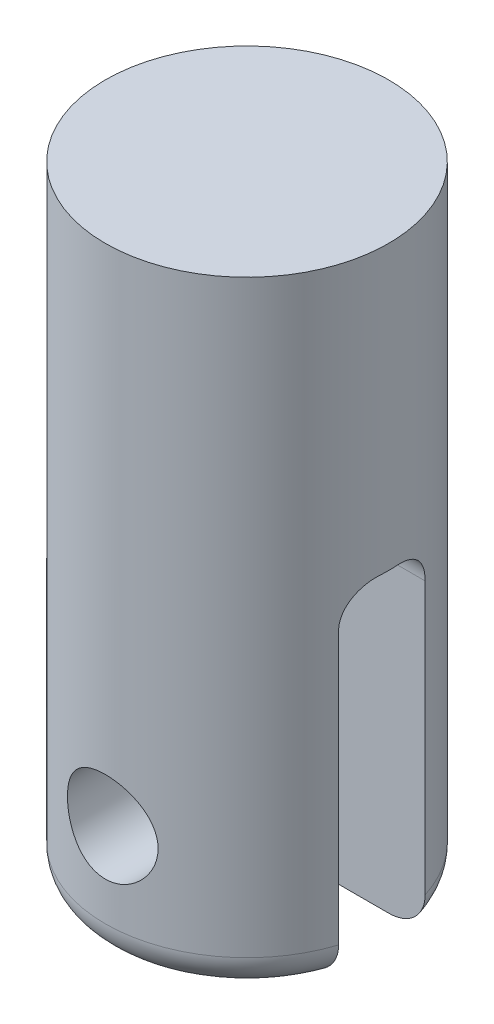
ISO-10303-21;
HEADER;
FILE_DESCRIPTION(('STEP AP214'),'2;1');
FILE_NAME('part.step','',(''),(''),'','','');
FILE_SCHEMA(('AUTOMOTIVE_DESIGN { 1 0 10303 214 1 1 1 1 }'));
ENDSEC;
DATA;
#1=APPLICATION_CONTEXT('core data for automotive mechanical design processes');
#2=APPLICATION_PROTOCOL_DEFINITION('international standard','automotive_design',2000,#1);
#3=PRODUCT_CONTEXT('',#1,'mechanical');
#4=PRODUCT('Part','Part','',(#3));
#5=PRODUCT_RELATED_PRODUCT_CATEGORY('part','',(#4));
#6=PRODUCT_DEFINITION_FORMATION('','',#4);
#7=PRODUCT_DEFINITION_CONTEXT('part definition',#1,'design');
#8=PRODUCT_DEFINITION('design','',#6,#7);
#9=PRODUCT_DEFINITION_SHAPE('','',#8);
#10=(LENGTH_UNIT() NAMED_UNIT(*) SI_UNIT(.MILLI.,.METRE.));
#11=(NAMED_UNIT(*) PLANE_ANGLE_UNIT() SI_UNIT($,.RADIAN.));
#12=(NAMED_UNIT(*) SI_UNIT($,.STERADIAN.) SOLID_ANGLE_UNIT());
#13=UNCERTAINTY_MEASURE_WITH_UNIT(LENGTH_MEASURE(1.E-05),#10,'distance_accuracy_value','');
#14=(GEOMETRIC_REPRESENTATION_CONTEXT(3) GLOBAL_UNCERTAINTY_ASSIGNED_CONTEXT((#13)) GLOBAL_UNIT_ASSIGNED_CONTEXT((#10,
#11,#12)) REPRESENTATION_CONTEXT('',''));
#15=CARTESIAN_POINT('',(0.,0.,0.));
#16=DIRECTION('',(0.,0.,1.));
#17=DIRECTION('',(1.,0.,0.));
#18=AXIS2_PLACEMENT_3D('',#15,#16,#17);
#19=CARTESIAN_POINT('',(0.,-15.,0.));
#20=DIRECTION('',(0.,1.,0.));
#21=DIRECTION('',(0.,0.,1.));
#22=AXIS2_PLACEMENT_3D('',#19,#20,#21);
#23=PLANE('',#22);
#24=DIRECTION('',(-1.,0.,0.));
#25=VECTOR('',#24,1.);
#26=CARTESIAN_POINT('',(0.,-15.,-3.81769416483632));
#27=LINE('',#26,#25);
#28=CARTESIAN_POINT('',(8.69915003111078,-15.,-3.81769416483632));
#29=VERTEX_POINT('',#28);
#30=CARTESIAN_POINT('',(-8.69915003111078,-15.,-3.81769416483632));
#31=VERTEX_POINT('',#30);
#32=EDGE_CURVE('E112',#29,#31,#27,.T.);
#33=ORIENTED_EDGE('',*,*,#32,.T.);
#34=CARTESIAN_POINT('',(0.,-15.,0.));
#35=DIRECTION('',(0.,1.,0.));
#36=DIRECTION('',(0.,0.,1.));
#37=AXIS2_PLACEMENT_3D('',#34,#35,#36);
#38=CIRCLE('',#37,9.5);
#39=EDGE_CURVE('E239',#31,#29,#38,.F.);
#40=ORIENTED_EDGE('',*,*,#39,.T.);
#41=EDGE_LOOP('',(#33,#40));
#42=FACE_BOUND('',#41,.T.);
#43=ADVANCED_FACE('F31',(#42),#23,.F.);
#44=CARTESIAN_POINT('',(0.,40.,0.));
#45=DIRECTION('',(0.,-1.,0.));
#46=DIRECTION('',(0.,0.,-1.));
#47=AXIS2_PLACEMENT_3D('',#44,#45,#46);
#48=CYLINDRICAL_SURFACE('',#47,12.5);
#49=CARTESIAN_POINT('',(0.,-0.58171759885595,-12.5));
#50=CARTESIAN_POINT('',(-0.218739515789949,-0.58171820798241,-12.4999994635907));
#51=CARTESIAN_POINT('',(-0.437486592647652,-0.59971908705409,-12.4942046039089));
#52=CARTESIAN_POINT('',(-0.868567253093707,-0.671047147679103,-12.4716565543057));
#53=CARTESIAN_POINT('',(-1.08089965843427,-0.724380778400727,-12.454901363839));
#54=CARTESIAN_POINT('',(-1.49287306447891,-0.864379901885378,-12.4122595908852));
#55=CARTESIAN_POINT('',(-1.69253368346149,-0.950992329782463,-12.3863875511298));
#56=CARTESIAN_POINT('',(-2.07449690712789,-1.1548596740741,-12.3281725410718));
#57=CARTESIAN_POINT('',(-2.25679651756237,-1.27211986326997,-12.2958284575098));
#58=CARTESIAN_POINT('',(-2.60473689448745,-1.53792788261603,-12.2269266983455));
#59=CARTESIAN_POINT('',(-2.76974023061599,-1.68728534623953,-12.1902739433225));
#60=CARTESIAN_POINT('',(-3.07283559233071,-2.01132526522444,-12.1174266425772));
#61=CARTESIAN_POINT('',(-3.21092229484498,-2.18601271799302,-12.0812321888099));
#62=CARTESIAN_POINT('',(-3.45978487684573,-2.56134973513202,-12.012370269974));
#63=CARTESIAN_POINT('',(-3.56975307774839,-2.76255830203272,-11.9798196408788));
#64=CARTESIAN_POINT('',(-3.75402292836496,-3.18182345828081,-11.9233664449728));
#65=CARTESIAN_POINT('',(-3.82833449433394,-3.39987534382518,-11.8994614742253));
#66=CARTESIAN_POINT('',(-3.93682835778228,-3.83942411703963,-11.8640030689908));
#67=CARTESIAN_POINT('',(-3.97219742115686,-4.0605978532415,-11.8520853732299));
#68=CARTESIAN_POINT('',(-4.00551082647404,-4.50603659681162,-11.8408707762137));
#69=CARTESIAN_POINT('',(-4.00346567735333,-4.7303007184655,-11.8415703310132));
#70=CARTESIAN_POINT('',(-3.96293451839878,-5.16563156110501,-11.8551904771854));
#71=CARTESIAN_POINT('',(-3.92597105327877,-5.37685873255691,-11.8676004346024));
#72=CARTESIAN_POINT('',(-3.81912647431514,-5.78993970999589,-11.9024114349979));
#73=CARTESIAN_POINT('',(-3.74924170672462,-5.99179247283861,-11.9248135869381));
#74=CARTESIAN_POINT('',(-3.57749112898224,-6.38396224589293,-11.9774663544073));
#75=CARTESIAN_POINT('',(-3.47515682759627,-6.57405814872729,-12.0078307368189));
#76=CARTESIAN_POINT('',(-3.24173735834848,-6.93487270643022,-12.0729361214443));
#77=CARTESIAN_POINT('',(-3.11064442067799,-7.1055861057168,-12.1076783053403));
#78=CARTESIAN_POINT('',(-2.81601378851059,-7.43137928101955,-12.1796593035711));
#79=CARTESIAN_POINT('',(-2.6512234062353,-7.58531954120242,-12.216938020211));
#80=CARTESIAN_POINT('',(-2.29770358054263,-7.86366429444063,-12.2883292028654));
#81=CARTESIAN_POINT('',(-2.10897218913167,-7.98806638171334,-12.3224414108409));
#82=CARTESIAN_POINT('',(-1.710653951781,-8.20462620705636,-12.3840447436164));
#83=CARTESIAN_POINT('',(-1.50090319860161,-8.29650035094699,-12.411477013699));
#84=CARTESIAN_POINT('',(-1.06783962590281,-8.44331659051276,-12.4562040275044));
#85=CARTESIAN_POINT('',(-0.844531157828865,-8.49827046839775,-12.4735020051158));
#86=CARTESIAN_POINT('',(-0.4003544739733,-8.56771776551898,-12.4954856059785));
#87=CARTESIAN_POINT('',(-0.179750715042685,-8.5837527828837,-12.5006515044539));
#88=CARTESIAN_POINT('',(0.261025673970266,-8.57926955330269,-12.4992163829611));
#89=CARTESIAN_POINT('',(0.4811983652186,-8.55875693558125,-12.4926171751051));
#90=CARTESIAN_POINT('',(0.908837545509531,-8.48299231615304,-12.4687095079374));
#91=CARTESIAN_POINT('',(1.11648590619506,-8.42866782364119,-12.4516871662316));
#92=CARTESIAN_POINT('',(1.51965413650146,-8.28796310036532,-12.4089396498837));
#93=CARTESIAN_POINT('',(1.71517248448531,-8.20157885735051,-12.3832133859887));
#94=CARTESIAN_POINT('',(2.09399230967611,-7.99679005591057,-12.3248882754976));
#95=CARTESIAN_POINT('',(2.27686405125242,-7.87763631900019,-12.2921331567523));
#96=CARTESIAN_POINT('',(2.62052875751655,-7.61158291639186,-12.223485206012));
#97=CARTESIAN_POINT('',(2.78131543888496,-7.46467538271019,-12.187591485802));
#98=CARTESIAN_POINT('',(3.08320803721588,-7.14003219982855,-12.1148241820809));
#99=CARTESIAN_POINT('',(3.22321448689051,-6.96126692963475,-12.0779721041684));
#100=CARTESIAN_POINT('',(3.47135354981423,-6.58198091271042,-12.0090110777536));
#101=CARTESIAN_POINT('',(3.57948642564104,-6.38146034522083,-11.9769020901785));
#102=CARTESIAN_POINT('',(3.76018950753079,-5.96460865221574,-11.9214065721644));
#103=CARTESIAN_POINT('',(3.83287665768614,-5.74833226138172,-11.8979914205013));
#104=CARTESIAN_POINT('',(3.94051670615503,-5.30569957433014,-11.8627820424832));
#105=CARTESIAN_POINT('',(3.97548487516417,-5.07934739601599,-11.8509831134183));
#106=CARTESIAN_POINT('',(4.00556338278915,-4.63452767594597,-11.8408481974692));
#107=CARTESIAN_POINT('',(4.00248471115015,-4.41619507053347,-11.8419004772846));
#108=CARTESIAN_POINT('',(3.96095887873426,-3.9833250852692,-11.8558539773436));
#109=CARTESIAN_POINT('',(3.92251352152803,-3.76878751245337,-11.8687545933658));
#110=CARTESIAN_POINT('',(3.81258331041153,-3.35300903541374,-11.9045135786104));
#111=CARTESIAN_POINT('',(3.74164069856766,-3.15160960162377,-11.9272081809191));
#112=CARTESIAN_POINT('',(3.56916068710955,-2.76341319785392,-11.979949389859));
#113=CARTESIAN_POINT('',(3.46761685286564,-2.5766193094492,-12.009997542498));
#114=CARTESIAN_POINT('',(3.2319816676858,-2.21469352431993,-12.0755873592094));
#115=CARTESIAN_POINT('',(3.09673271078946,-2.04034694202084,-12.111302976317));
#116=CARTESIAN_POINT('',(2.79953499482211,-1.71623823430354,-12.1834295211838));
#117=CARTESIAN_POINT('',(2.63757895417057,-1.56648283585933,-12.2198406361674));
#118=CARTESIAN_POINT('',(2.28478052574588,-1.29057188404637,-12.2907777050029));
#119=CARTESIAN_POINT('',(2.09312837940195,-1.16542021914519,-12.3251937970096));
#120=CARTESIAN_POINT('',(1.69040882481734,-0.949267128612882,-12.3868446924465));
#121=CARTESIAN_POINT('',(1.47934815802039,-0.858253900553964,-12.4140819767823));
#122=CARTESIAN_POINT('',(1.05915857911211,-0.71859814927985,-12.4567085266016));
#123=CARTESIAN_POINT('',(0.850941916218325,-0.667421472398177,-12.4727975325363));
#124=CARTESIAN_POINT('',(0.428485002690298,-0.59898474159592,-12.4944423385348));
#125=CARTESIAN_POINT('',(0.214246128153487,-0.581717002242278,-12.5000005253903));
#126=CARTESIAN_POINT('',(0.,-0.58171759885595,-12.5));
#127=B_SPLINE_CURVE_WITH_KNOTS('',3,(#49,#50,#51,#52,#53,#54,#55,#56,#57,#58,#59,#60,#61,#62,
#63,#64,#65,#66,#67,#68,#69,#70,#71,#72,#73,#74,#75,#76,#77,#78,#79,#80,#81,#82,#83,#84,#85,#86,
#87,#88,#89,#90,#91,#92,#93,#94,#95,#96,#97,#98,#99,#100,#101,#102,#103,#104,#105,#106,#107,
#108,#109,#110,#111,#112,#113,#114,#115,#116,#117,#118,#119,#120,#121,#122,#123,#124,#125,#126),
.UNSPECIFIED.,.T.,.F.,(4,2,2,2,2,2,2,2,2,2,2,2,2,2,2,2,2,2,2,2,2,2,2,2,2,2,2,2,2,2,2,2,2,2,2,2,
2,2,4),(0.,0.655430724666219,1.31098111587091,1.96549050527928,2.62011257411757,
3.29374295378917,3.96750641671065,4.65887072066567,5.35004264179887,6.01951224998766,
6.68879381985559,7.33017723381302,7.97163184802041,8.62280489842004,9.27415409537618,
9.95668212026653,10.6392657156648,11.3276617834058,12.0158380617097,12.6762752648346,
13.3366107533684,13.9795854097457,14.6226405610093,15.281833876428,15.9412143491714,
16.6280748263774,17.3149296449995,17.9995027669286,18.6837986322709,19.3356533743721,
19.9874748761256,20.6287955720838,21.2702512150686,21.937843916949,22.6056189371905,
23.2966571383324,23.9874562112942,24.6295685076846,25.2715352530413),.UNSPECIFIED.);
#128=CARTESIAN_POINT('',(0.,-0.58171759885595,-12.5));
#129=VERTEX_POINT('',#128);
#130=EDGE_CURVE('E166',#129,#129,#127,.T.);
#131=ORIENTED_EDGE('',*,*,#130,.T.);
#132=EDGE_LOOP('',(#131));
#133=FACE_BOUND('',#132,.T.);
#134=CARTESIAN_POINT('',(4.,-4.58171759885595,11.842719282327));
#135=CARTESIAN_POINT('',(3.99999935935302,-4.80013319382885,11.8427199699566));
#136=CARTESIAN_POINT('',(3.98204982916322,-5.01855635824237,11.8488277399487));
#137=CARTESIAN_POINT('',(3.91094422931103,-5.44896656790635,11.8724842974625));
#138=CARTESIAN_POINT('',(3.85777999166795,-5.6609521080295,11.8900357393061));
#139=CARTESIAN_POINT('',(3.71827554706383,-6.07218785295789,11.9343925365716));
#140=CARTESIAN_POINT('',(3.6319962541729,-6.2714606621111,11.9611808918508));
#141=CARTESIAN_POINT('',(3.42891586136008,-6.65276170141101,12.0209691387475));
#142=CARTESIAN_POINT('',(3.3121088807135,-6.83478659977764,12.0539702268166));
#143=CARTESIAN_POINT('',(3.04678104882872,-7.18298358668528,12.1237992191192));
#144=CARTESIAN_POINT('',(2.89734836823298,-7.34844301254282,12.1607169507637));
#145=CARTESIAN_POINT('',(2.57296030582542,-7.65243366351566,12.2334570053411));
#146=CARTESIAN_POINT('',(2.39800118371827,-7.79096093541142,12.269279166812));
#147=CARTESIAN_POINT('',(2.02237355615693,-8.04033106210593,12.3368238271391));
#148=CARTESIAN_POINT('',(1.82119171965248,-8.15043547212909,12.3684282786178));
#149=CARTESIAN_POINT('',(1.40198048377137,-8.33496400877002,12.4229242661366));
#150=CARTESIAN_POINT('',(1.18395526351671,-8.40939695326265,12.4458179551613));
#151=CARTESIAN_POINT('',(0.744711775297691,-8.51807704692684,12.479676950379));
#152=CARTESIAN_POINT('',(0.523823472185482,-8.55354324300997,12.4910032748545));
#153=CARTESIAN_POINT('',(0.0789603248012283,-8.58715036260871,12.5017287029849));
#154=CARTESIAN_POINT('',(-0.145013772077129,-8.58530017086042,12.5011306457409));
#155=CARTESIAN_POINT('',(-0.581093729167385,-8.54511884392504,12.4883236997896));
#156=CARTESIAN_POINT('',(-0.793335790758782,-8.50811010425446,12.4765357034484));
#157=CARTESIAN_POINT('',(-1.20842073412411,-8.40083804075302,12.4431948493389));
#158=CARTESIAN_POINT('',(-1.41126299248278,-8.33057251471587,12.4216413449197));
#159=CARTESIAN_POINT('',(-1.80478487403707,-8.15795951756165,12.3706365500491));
#160=CARTESIAN_POINT('',(-1.99527942968321,-8.055219644873,12.3410893332516));
#161=CARTESIAN_POINT('',(-2.35672859352838,-7.82089208160862,12.2771970855205));
#162=CARTESIAN_POINT('',(-2.52767806251326,-7.68929683017585,12.2428507979634));
#163=CARTESIAN_POINT('',(-2.8530638131067,-7.39424849452669,12.1712367294856));
#164=CARTESIAN_POINT('',(-3.00645534449559,-7.22965669122626,12.1339068619231));
#165=CARTESIAN_POINT('',(-3.28378018395939,-6.87674694639285,12.0618145989439));
#166=CARTESIAN_POINT('',(-3.40770966195435,-6.68842592491463,12.0270525377475));
#167=CARTESIAN_POINT('',(-3.62388810953954,-6.29032574816508,11.9637089339779));
#168=CARTESIAN_POINT('',(-3.71573126088371,-6.08031241059497,11.9352081440021));
#169=CARTESIAN_POINT('',(-3.8624115437165,-5.64666558305902,11.8885562852076));
#170=CARTESIAN_POINT('',(-3.91726274260851,-5.42303730593334,11.8704012824717));
#171=CARTESIAN_POINT('',(-3.98634732980607,-4.97855782359076,11.8473757948988));
#172=CARTESIAN_POINT('',(-4.00218769386191,-4.75798347803412,11.8419801089925));
#173=CARTESIAN_POINT('',(-3.99732669767184,-4.31730692251951,11.8436224693089));
#174=CARTESIAN_POINT('',(-3.97663132425953,-4.09720464112496,11.8506584784444));
#175=CARTESIAN_POINT('',(-3.90072533361949,-3.67077503049411,11.8758511036107));
#176=CARTESIAN_POINT('',(-3.84659716428486,-3.46423223210869,11.8936586123319));
#177=CARTESIAN_POINT('',(-3.70664280725108,-3.06318969950637,11.9380128770361));
#178=CARTESIAN_POINT('',(-3.62081128645948,-2.86869199792979,11.9645611032884));
#179=CARTESIAN_POINT('',(-3.41697396012587,-2.49084798095137,12.0243860591649));
#180=CARTESIAN_POINT('',(-3.29808617389174,-2.30800620183265,12.0578396098649));
#181=CARTESIAN_POINT('',(-3.03252999413196,-1.96428404339651,12.1273479833206));
#182=CARTESIAN_POINT('',(-2.88585403708636,-1.80340966383519,12.1634035126375));
#183=CARTESIAN_POINT('',(-2.56125244512296,-1.50091982227044,12.2359628130699));
#184=CARTESIAN_POINT('',(-2.38223997872511,-1.36045559489664,12.2724171226716));
#185=CARTESIAN_POINT('',(-2.00229721221567,-1.11150490566416,12.3400966382304));
#186=CARTESIAN_POINT('',(-1.80136784836229,-1.00301707855224,12.3713220674134));
#187=CARTESIAN_POINT('',(-1.38445940226065,-0.822127605686678,12.4248572290492));
#188=CARTESIAN_POINT('',(-1.16859881389168,-0.749472302821514,12.4472294035216));
#189=CARTESIAN_POINT('',(-0.726874957063008,-0.641757338579116,12.480810616577));
#190=CARTESIAN_POINT('',(-0.501015012458268,-0.606685280538695,12.4920233359687));
#191=CARTESIAN_POINT('',(-0.0562765879062631,-0.576178329106579,12.5017663129826));
#192=CARTESIAN_POINT('',(0.162477761236097,-0.579084311281209,12.5008274477244));
#193=CARTESIAN_POINT('',(0.596238594775697,-0.620410310801539,12.4876568899275));
#194=CARTESIAN_POINT('',(0.81124534294192,-0.658827818356865,12.4754259954572));
#195=CARTESIAN_POINT('',(1.22850760398064,-0.769013275770849,12.4412233539435));
#196=CARTESIAN_POINT('',(1.4308971714329,-0.840318529970083,12.4193869374855));
#197=CARTESIAN_POINT('',(1.82093134276042,-1.01383412278666,12.3682230993078));
#198=CARTESIAN_POINT('',(2.00857335487159,-1.11604987844251,12.3388943647058));
#199=CARTESIAN_POINT('',(2.37094464163666,-1.35262036831947,12.2745138549376));
#200=CARTESIAN_POINT('',(2.54499113183174,-1.48797568936698,12.2392975634481));
#201=CARTESIAN_POINT('',(2.86844801950664,-1.78524078845687,12.1675595998111));
#202=CARTESIAN_POINT('',(3.0178508446577,-1.94715869809117,12.1310375306124));
#203=CARTESIAN_POINT('',(3.29310491309765,-2.29978421294634,12.0592883124172));
#204=CARTESIAN_POINT('',(3.41794102245578,-2.49130510403453,12.0241521106559));
#205=CARTESIAN_POINT('',(3.63353471705189,-2.89367936303823,11.9607741956668));
#206=CARTESIAN_POINT('',(3.72430441468119,-3.10452582646278,11.9325300332104));
#207=CARTESIAN_POINT('',(3.86354015966022,-3.52417470162676,11.8881467072458));
#208=CARTESIAN_POINT('',(3.91455627646292,-3.73205548857024,11.8712893448615));
#209=CARTESIAN_POINT('',(3.98278180434112,-4.15386209590346,11.8485768271906));
#210=CARTESIAN_POINT('',(4.00000062749409,-4.36778621646959,11.8427186088149));
#211=CARTESIAN_POINT('',(4.,-4.58171759885595,11.842719282327));
#212=B_SPLINE_CURVE_WITH_KNOTS('',3,(#134,#135,#136,#137,#138,#139,#140,#141,#142,#143,#144,
#145,#146,#147,#148,#149,#150,#151,#152,#153,#154,#155,#156,#157,#158,#159,#160,#161,#162,#163,
#164,#165,#166,#167,#168,#169,#170,#171,#172,#173,#174,#175,#176,#177,#178,#179,#180,#181,#182,
#183,#184,#185,#186,#187,#188,#189,#190,#191,#192,#193,#194,#195,#196,#197,#198,#199,#200,#201,
#202,#203,#204,#205,#206,#207,#208,#209,#210,#211),.UNSPECIFIED.,.T.,.F.,(4,2,2,2,2,2,2,2,2,2,2,
2,2,2,2,2,2,2,2,2,2,2,2,2,2,2,2,2,2,2,2,2,2,2,2,2,2,2,4),(0.,0.654455842715354,1.309063538331,
1.96247283098349,2.6160080865338,3.29090543042416,3.96590176403351,4.65698443727681,
5.34789618881213,6.01651686048925,6.68497834076492,7.32925318507043,7.97357069810019,
8.62599225189614,9.27858496176539,9.95962670810642,10.6407569418194,11.3302140454822,
12.0194088123988,12.6796997833962,13.3398825675735,13.979736408686,14.6196979341528,
15.2787163323882,15.9379143638459,16.6259668097989,17.3139898746478,17.9970699222358,
18.6799245895442,19.3330513205858,19.9861318951797,20.6302921470087,21.2745653528473,
21.9414122843778,22.6084637396799,23.2990150253329,23.9893205507533,24.6305185843684,
25.2715380278761),.UNSPECIFIED.);
#213=CARTESIAN_POINT('',(4.,-4.58171759885595,11.842719282327));
#214=VERTEX_POINT('',#213);
#215=EDGE_CURVE('E158',#214,#214,#212,.T.);
#216=ORIENTED_EDGE('',*,*,#215,.T.);
#217=EDGE_LOOP('',(#216));
#218=FACE_BOUND('',#217,.T.);
#219=CARTESIAN_POINT('',(0.,15.,0.));
#220=DIRECTION('',(0.,1.,0.));
#221=DIRECTION('',(0.,0.,1.));
#222=AXIS2_PLACEMENT_3D('',#219,#220,#221);
#223=CIRCLE('',#222,12.5);
#224=CARTESIAN_POINT('',(12.4732263770362,15.,0.817694164836319));
#225=VERTEX_POINT('',#224);
#226=CARTESIAN_POINT('',(12.4732263770362,15.,-0.817694164836319));
#227=VERTEX_POINT('',#226);
#228=EDGE_CURVE('E121',#225,#227,#223,.T.);
#229=ORIENTED_EDGE('',*,*,#228,.T.);
#230=CARTESIAN_POINT('',(12.4732263770362,15.,-0.817694164836319));
#231=CARTESIAN_POINT('',(12.4677246550819,15.0000092477589,-0.901742849952741));
#232=CARTESIAN_POINT('',(12.4613578571028,14.9964681031644,-0.985726918183737));
#233=CARTESIAN_POINT('',(12.4469954868453,14.9823864557986,-1.15294877388891));
#234=CARTESIAN_POINT('',(12.4390002569015,14.9718474230964,-1.23618671438319));
#235=CARTESIAN_POINT('',(12.4214981844874,14.9439003732691,-1.40116371702515));
#236=CARTESIAN_POINT('',(12.4119945133042,14.9265066558568,-1.48290553115308));
#237=CARTESIAN_POINT('',(12.3916235762277,14.8850292344187,-1.64447830674691));
#238=CARTESIAN_POINT('',(12.3807562723462,14.8609453439949,-1.72430921490483));
#239=CARTESIAN_POINT('',(12.3463848719155,14.7789547029308,-1.96007362217547));
#240=CARTESIAN_POINT('',(12.32108990483,14.7112753075629,-2.1124752965546));
#241=CARTESIAN_POINT('',(12.2676312430189,14.551968398042,-2.40358408940796));
#242=CARTESIAN_POINT('',(12.2394665077446,14.4603321783967,-2.54228620440523));
#243=CARTESIAN_POINT('',(12.1818417072531,14.2532113520426,-2.80558384517905));
#244=CARTESIAN_POINT('',(12.1523667537717,14.1372352315241,-2.92979039618466));
#245=CARTESIAN_POINT('',(12.095310013888,13.8857208478648,-3.15709480362909));
#246=CARTESIAN_POINT('',(12.0677285741512,13.7501790166402,-3.26018880158324));
#247=CARTESIAN_POINT('',(12.0168772632869,13.4620069838052,-3.44292707714872));
#248=CARTESIAN_POINT('',(11.993638608886,13.3092648271764,-3.52240382842607));
#249=CARTESIAN_POINT('',(11.9541353656157,12.9917264866829,-3.65423337695504));
#250=CARTESIAN_POINT('',(11.9378633820299,12.8269433023283,-3.7066149465277));
#251=CARTESIAN_POINT('',(11.9183482669265,12.5508256405537,-3.76876927260809));
#252=CARTESIAN_POINT('',(11.9125252767202,12.4415237053043,-3.78708630537543));
#253=CARTESIAN_POINT('',(11.9047087739608,12.2215026939053,-3.81155583118856));
#254=CARTESIAN_POINT('',(11.9027128815457,12.1107845415776,-3.81771588406263));
#255=CARTESIAN_POINT('',(11.9027396537005,12.,-3.81769416483632));
#256=B_SPLINE_CURVE_WITH_KNOTS('',3,(#230,#231,#232,#233,#234,#235,#236,#237,#238,#239,#240,
#241,#242,#243,#244,#245,#246,#247,#248,#249,#250,#251,#252,#253,#254,#255),.UNSPECIFIED.,.F.,
.F.,(4,2,2,2,2,2,2,2,2,2,2,2,4),(0.,0.252593902254698,0.505134758066573,0.757151548020939,
1.00917536023872,1.51262900432377,2.01626584959374,2.53126813443214,3.04636445614745,
3.56503181760422,4.08314727062916,4.41539350375971,4.74743306410497),.UNSPECIFIED.);
#257=CARTESIAN_POINT('',(11.9027396537005,12.,-3.81769416483632));
#258=VERTEX_POINT('',#257);
#259=EDGE_CURVE('E44',#227,#258,#256,.T.);
#260=ORIENTED_EDGE('',*,*,#259,.T.);
#261=DIRECTION('',(0.,-1.,0.));
#262=VECTOR('',#261,1.);
#263=CARTESIAN_POINT('',(11.9027396537005,40.,-3.81769416483632));
#264=LINE('',#263,#262);
#265=CARTESIAN_POINT('',(11.9027396537005,-12.,-3.81769416483632));
#266=VERTEX_POINT('',#265);
#267=EDGE_CURVE('E98',#258,#266,#264,.T.);
#268=ORIENTED_EDGE('',*,*,#267,.T.);
#269=CARTESIAN_POINT('',(0.,-12.,0.));
#270=DIRECTION('',(0.,1.,0.));
#271=DIRECTION('',(0.,0.,1.));
#272=AXIS2_PLACEMENT_3D('',#269,#270,#271);
#273=CIRCLE('',#272,12.5);
#274=CARTESIAN_POINT('',(-11.9027396537005,-12.,-3.81769416483632));
#275=VERTEX_POINT('',#274);
#276=EDGE_CURVE('E103',#266,#275,#273,.T.);
#277=ORIENTED_EDGE('',*,*,#276,.T.);
#278=DIRECTION('',(0.,-1.,0.));
#279=VECTOR('',#278,1.);
#280=CARTESIAN_POINT('',(-11.9027396537005,40.,-3.81769416483632));
#281=LINE('',#280,#279);
#282=CARTESIAN_POINT('',(-11.9027396537005,12.,-3.81769416483632));
#283=VERTEX_POINT('',#282);
#284=EDGE_CURVE('E105',#275,#283,#281,.F.);
#285=ORIENTED_EDGE('',*,*,#284,.T.);
#286=CARTESIAN_POINT('',(-11.9027396537005,12.,-3.81769416483632));
#287=CARTESIAN_POINT('',(-11.9027297875858,12.0821061358962,-3.81770447780734));
#288=CARTESIAN_POINT('',(-11.9038205538704,12.164205930901,-3.81432364845903));
#289=CARTESIAN_POINT('',(-11.9081298465607,12.3277808405551,-3.80085974658389));
#290=CARTESIAN_POINT('',(-11.91134791832,12.4092560849199,-3.79077810614763));
#291=CARTESIAN_POINT('',(-11.9198275144982,12.5707985752105,-3.76402682483675));
#292=CARTESIAN_POINT('',(-11.9250837898422,12.6508688900908,-3.74737410482615));
#293=CARTESIAN_POINT('',(-11.9374951182411,12.8092282247308,-3.70764620768877));
#294=CARTESIAN_POINT('',(-11.9446502149739,12.88751720347,-3.68457088282443));
#295=CARTESIAN_POINT('',(-11.968702369576,13.1188531104447,-3.60599536738304));
#296=CARTESIAN_POINT('',(-11.9881971975251,13.2685646235091,-3.54111287764292));
#297=CARTESIAN_POINT('',(-12.0322445006095,13.5549204879118,-3.38841673055315));
#298=CARTESIAN_POINT('',(-12.0567992368627,13.6915589571973,-3.30059281667255));
#299=CARTESIAN_POINT('',(-12.1095276333921,13.9522252284131,-3.10164526744036));
#300=CARTESIAN_POINT('',(-12.1377838005831,14.0757889294985,-2.98993458390723));
#301=CARTESIAN_POINT('',(-12.1948987610028,14.3027379814472,-2.74770947855668));
#302=CARTESIAN_POINT('',(-12.2237577171328,14.4061177975049,-2.61718991599283));
#303=CARTESIAN_POINT('',(-12.2805565984772,14.5928019764256,-2.33645481987373));
#304=CARTESIAN_POINT('',(-12.3084432566148,14.6754137812076,-2.18576711717954));
#305=CARTESIAN_POINT('',(-12.3600558873494,14.8138734613561,-1.87196008850985));
#306=CARTESIAN_POINT('',(-12.3837850843074,14.8697421364015,-1.70885053855004));
#307=CARTESIAN_POINT('',(-12.419209539945,14.9406408613462,-1.42386187782225));
#308=CARTESIAN_POINT('',(-12.4323936339292,14.9628402753311,-1.30390448188564));
#309=CARTESIAN_POINT('',(-12.4554113498229,14.9925313700867,-1.06192791343953));
#310=CARTESIAN_POINT('',(-12.4652465203752,15.0000298566607,-0.939909721378202));
#311=CARTESIAN_POINT('',(-12.4732263770362,15.,-0.817694164836319));
#312=B_SPLINE_CURVE_WITH_KNOTS('',3,(#286,#287,#288,#289,#290,#291,#292,#293,#294,#295,#296,
#297,#298,#299,#300,#301,#302,#303,#304,#305,#306,#307,#308,#309,#310,#311),.UNSPECIFIED.,.F.,
.F.,(4,2,2,2,2,2,2,2,2,2,2,2,4),(0.,0.246230764637279,0.492408921998416,0.737957252147882,
0.983511231050028,1.47403077285351,1.96476998999513,2.46934369659993,2.97405557318491,
3.49385601750595,4.0132515234235,4.38046948091632,4.74751739444662),.UNSPECIFIED.);
#313=CARTESIAN_POINT('',(-12.4732263770362,15.,-0.817694164836319));
#314=VERTEX_POINT('',#313);
#315=EDGE_CURVE('E11',#283,#314,#312,.T.);
#316=ORIENTED_EDGE('',*,*,#315,.T.);
#317=CARTESIAN_POINT('',(-12.4732263770362,15.,0.817694164836319));
#318=VERTEX_POINT('',#317);
#319=EDGE_CURVE('E240',#314,#318,#223,.T.);
#320=ORIENTED_EDGE('',*,*,#319,.T.);
#321=CARTESIAN_POINT('',(-12.4732263770362,15.,0.817694164836319));
#322=CARTESIAN_POINT('',(-12.4677246550819,15.0000092477589,0.901742849952741));
#323=CARTESIAN_POINT('',(-12.4613578571028,14.9964681031644,0.985726918183737));
#324=CARTESIAN_POINT('',(-12.4469954868453,14.9823864557986,1.15294877388891));
#325=CARTESIAN_POINT('',(-12.4390002569015,14.9718474230964,1.23618671438319));
#326=CARTESIAN_POINT('',(-12.4214981844874,14.9439003732691,1.40116371702515));
#327=CARTESIAN_POINT('',(-12.4119945133042,14.9265066558568,1.48290553115308));
#328=CARTESIAN_POINT('',(-12.3916235762277,14.8850292344187,1.64447830674691));
#329=CARTESIAN_POINT('',(-12.3807562723462,14.8609453439949,1.72430921490483));
#330=CARTESIAN_POINT('',(-12.3463848719155,14.7789547029308,1.96007362217547));
#331=CARTESIAN_POINT('',(-12.32108990483,14.7112753075629,2.1124752965546));
#332=CARTESIAN_POINT('',(-12.2676312430189,14.551968398042,2.40358408940796));
#333=CARTESIAN_POINT('',(-12.2394665077446,14.4603321783967,2.54228620440523));
#334=CARTESIAN_POINT('',(-12.1818417072531,14.2532113520426,2.80558384517905));
#335=CARTESIAN_POINT('',(-12.1523667537717,14.1372352315241,2.92979039618466));
#336=CARTESIAN_POINT('',(-12.095310013888,13.8857208478648,3.15709480362909));
#337=CARTESIAN_POINT('',(-12.0677285741512,13.7501790166402,3.26018880158324));
#338=CARTESIAN_POINT('',(-12.0168772632869,13.4620069838052,3.44292707714872));
#339=CARTESIAN_POINT('',(-11.993638608886,13.3092648271764,3.52240382842607));
#340=CARTESIAN_POINT('',(-11.9541353656157,12.9917264866829,3.65423337695504));
#341=CARTESIAN_POINT('',(-11.9378633820299,12.8269433023283,3.7066149465277));
#342=CARTESIAN_POINT('',(-11.9183482669265,12.5508256405537,3.76876927260809));
#343=CARTESIAN_POINT('',(-11.9125252767202,12.4415237053043,3.78708630537543));
#344=CARTESIAN_POINT('',(-11.9047087739608,12.2215026939053,3.81155583118857));
#345=CARTESIAN_POINT('',(-11.9027128815457,12.1107845415776,3.81771588406263));
#346=CARTESIAN_POINT('',(-11.9027396537005,12.,3.81769416483632));
#347=B_SPLINE_CURVE_WITH_KNOTS('',3,(#321,#322,#323,#324,#325,#326,#327,#328,#329,#330,#331,
#332,#333,#334,#335,#336,#337,#338,#339,#340,#341,#342,#343,#344,#345,#346),.UNSPECIFIED.,.F.,
.F.,(4,2,2,2,2,2,2,2,2,2,2,2,4),(0.,0.252593902254698,0.505134758066573,0.757151548020939,
1.00917536023872,1.51262900432377,2.01626584959374,2.53126813443214,3.04636445614745,
3.56503181760422,4.08314727062916,4.41539350375971,4.74743306410497),.UNSPECIFIED.);
#348=CARTESIAN_POINT('',(-11.9027396537005,12.,3.81769416483632));
#349=VERTEX_POINT('',#348);
#350=EDGE_CURVE('E178',#318,#349,#347,.T.);
#351=ORIENTED_EDGE('',*,*,#350,.T.);
#352=DIRECTION('',(0.,-1.,0.));
#353=VECTOR('',#352,1.);
#354=CARTESIAN_POINT('',(-11.9027396537005,40.,3.81769416483632));
#355=LINE('',#354,#353);
#356=CARTESIAN_POINT('',(-11.9027396537005,-12.,3.81769416483632));
#357=VERTEX_POINT('',#356);
#358=EDGE_CURVE('E245',#349,#357,#355,.T.);
#359=ORIENTED_EDGE('',*,*,#358,.T.);
#360=CARTESIAN_POINT('',(0.,-12.,0.));
#361=DIRECTION('',(0.,1.,0.));
#362=DIRECTION('',(0.,0.,1.));
#363=AXIS2_PLACEMENT_3D('',#360,#361,#362);
#364=CIRCLE('',#363,12.5);
#365=CARTESIAN_POINT('',(11.9027396537005,-12.,3.81769416483632));
#366=VERTEX_POINT('',#365);
#367=EDGE_CURVE('E118',#357,#366,#364,.T.);
#368=ORIENTED_EDGE('',*,*,#367,.T.);
#369=DIRECTION('',(0.,-1.,0.));
#370=VECTOR('',#369,1.);
#371=CARTESIAN_POINT('',(11.9027396537005,40.,3.81769416483632));
#372=LINE('',#371,#370);
#373=CARTESIAN_POINT('',(11.9027396537005,12.,3.81769416483632));
#374=VERTEX_POINT('',#373);
#375=EDGE_CURVE('E247',#366,#374,#372,.F.);
#376=ORIENTED_EDGE('',*,*,#375,.T.);
#377=CARTESIAN_POINT('',(11.9027396537005,12.,3.81769416483632));
#378=CARTESIAN_POINT('',(11.9027297875858,12.0821061358962,3.81770447780734));
#379=CARTESIAN_POINT('',(11.9038205538704,12.164205930901,3.81432364845903));
#380=CARTESIAN_POINT('',(11.9081298465607,12.3277808405551,3.80085974658389));
#381=CARTESIAN_POINT('',(11.91134791832,12.4092560849199,3.79077810614763));
#382=CARTESIAN_POINT('',(11.9198275144982,12.5707985752105,3.76402682483675));
#383=CARTESIAN_POINT('',(11.9250837898422,12.6508688900908,3.74737410482616));
#384=CARTESIAN_POINT('',(11.9374951182411,12.8092282247308,3.70764620768877));
#385=CARTESIAN_POINT('',(11.9446502149739,12.88751720347,3.68457088282443));
#386=CARTESIAN_POINT('',(11.968702369576,13.1188531104447,3.60599536738304));
#387=CARTESIAN_POINT('',(11.9881971975251,13.2685646235091,3.54111287764292));
#388=CARTESIAN_POINT('',(12.0322445006095,13.5549204879118,3.38841673055315));
#389=CARTESIAN_POINT('',(12.0567992368627,13.6915589571973,3.30059281667255));
#390=CARTESIAN_POINT('',(12.1095276333921,13.9522252284131,3.10164526744036));
#391=CARTESIAN_POINT('',(12.1377838005831,14.0757889294985,2.98993458390723));
#392=CARTESIAN_POINT('',(12.1948987610028,14.3027379814472,2.74770947855668));
#393=CARTESIAN_POINT('',(12.2237577171328,14.4061177975049,2.61718991599283));
#394=CARTESIAN_POINT('',(12.2805565984772,14.5928019764256,2.33645481987373));
#395=CARTESIAN_POINT('',(12.3084432566148,14.6754137812076,2.18576711717954));
#396=CARTESIAN_POINT('',(12.3600558873494,14.8138734613561,1.87196008850985));
#397=CARTESIAN_POINT('',(12.3837850843074,14.8697421364015,1.70885053855004));
#398=CARTESIAN_POINT('',(12.419209539945,14.9406408613462,1.42386187782226));
#399=CARTESIAN_POINT('',(12.4323936339292,14.9628402753311,1.30390448188564));
#400=CARTESIAN_POINT('',(12.4554113498229,14.9925313700867,1.06192791343953));
#401=CARTESIAN_POINT('',(12.4652465203752,15.0000298566607,0.939909721378202));
#402=CARTESIAN_POINT('',(12.4732263770362,15.,0.817694164836319));
#403=B_SPLINE_CURVE_WITH_KNOTS('',3,(#377,#378,#379,#380,#381,#382,#383,#384,#385,#386,#387,
#388,#389,#390,#391,#392,#393,#394,#395,#396,#397,#398,#399,#400,#401,#402),.UNSPECIFIED.,.F.,
.F.,(4,2,2,2,2,2,2,2,2,2,2,2,4),(0.,0.246230764637279,0.492408921998416,0.737957252147882,
0.983511231050028,1.47403077285351,1.96476998999513,2.46934369659993,2.97405557318491,
3.49385601750595,4.0132515234235,4.38046948091632,4.74751739444662),.UNSPECIFIED.);
#404=EDGE_CURVE('E172',#374,#225,#403,.T.);
#405=ORIENTED_EDGE('',*,*,#404,.T.);
#406=EDGE_LOOP('',(#229,#260,#268,#277,#285,#316,#320,#351,#359,#368,#376,#405));
#407=FACE_BOUND('',#406,.T.);
#408=CARTESIAN_POINT('',(0.,40.,0.));
#409=DIRECTION('',(0.,1.,0.));
#410=DIRECTION('',(0.,0.,1.));
#411=AXIS2_PLACEMENT_3D('',#408,#409,#410);
#412=CIRCLE('',#411,12.5);
#413=CARTESIAN_POINT('',(0.,40.,12.5));
#414=VERTEX_POINT('',#413);
#415=EDGE_CURVE('E104',#414,#414,#412,.T.);
#416=ORIENTED_EDGE('',*,*,#415,.F.);
#417=EDGE_LOOP('',(#416));
#418=FACE_BOUND('',#417,.T.);
#419=ADVANCED_FACE('F100',(#133,#218,#407,#418),#48,.T.);
#420=CARTESIAN_POINT('',(0.,40.,0.));
#421=DIRECTION('',(0.,1.,0.));
#422=DIRECTION('',(0.,0.,1.));
#423=AXIS2_PLACEMENT_3D('',#420,#421,#422);
#424=PLANE('',#423);
#425=ORIENTED_EDGE('',*,*,#415,.T.);
#426=EDGE_LOOP('',(#425));
#427=FACE_BOUND('',#426,.T.);
#428=ADVANCED_FACE('F144',(#427),#424,.T.);
#429=DIRECTION('',(1.,0.,0.));
#430=VECTOR('',#429,1.);
#431=CARTESIAN_POINT('',(0.,-15.,3.81769416483632));
#432=LINE('',#431,#430);
#433=CARTESIAN_POINT('',(-8.69915003111078,-15.,3.81769416483632));
#434=VERTEX_POINT('',#433);
#435=CARTESIAN_POINT('',(8.69915003111078,-15.,3.81769416483632));
#436=VERTEX_POINT('',#435);
#437=EDGE_CURVE('E241',#434,#436,#432,.T.);
#438=ORIENTED_EDGE('',*,*,#437,.T.);
#439=CARTESIAN_POINT('',(0.,-15.,0.));
#440=DIRECTION('',(0.,1.,0.));
#441=DIRECTION('',(0.,0.,1.));
#442=AXIS2_PLACEMENT_3D('',#439,#440,#441);
#443=CIRCLE('',#442,9.5);
#444=EDGE_CURVE('E199',#436,#434,#443,.F.);
#445=ORIENTED_EDGE('',*,*,#444,.T.);
#446=EDGE_LOOP('',(#438,#445));
#447=FACE_BOUND('',#446,.T.);
#448=ADVANCED_FACE('F148',(#447),#23,.F.);
#449=CARTESIAN_POINT('',(-25.,15.,3.81769416483632));
#450=DIRECTION('',(0.,1.,0.));
#451=DIRECTION('',(0.,0.,1.));
#452=AXIS2_PLACEMENT_3D('',#449,#450,#451);
#453=PLANE('',#452);
#454=ORIENTED_EDGE('',*,*,#228,.F.);
#455=DIRECTION('',(1.,0.,0.));
#456=VECTOR('',#455,1.);
#457=CARTESIAN_POINT('',(-11.9027396537005,15.,0.817694164836319));
#458=LINE('',#457,#456);
#459=EDGE_CURVE('E190',#225,#318,#458,.F.);
#460=ORIENTED_EDGE('',*,*,#459,.T.);
#461=ORIENTED_EDGE('',*,*,#319,.F.);
#462=DIRECTION('',(1.,0.,0.));
#463=VECTOR('',#462,1.);
#464=CARTESIAN_POINT('',(11.9027396537005,15.,-0.817694164836319));
#465=LINE('',#464,#463);
#466=EDGE_CURVE('E191',#314,#227,#465,.T.);
#467=ORIENTED_EDGE('',*,*,#466,.T.);
#468=EDGE_LOOP('',(#454,#460,#461,#467));
#469=FACE_BOUND('',#468,.T.);
#470=ADVANCED_FACE('F141',(#469),#453,.F.);
#471=CARTESIAN_POINT('',(-25.,15.,-3.81769416483632));
#472=DIRECTION('',(0.,0.,-1.));
#473=DIRECTION('',(0.,1.,0.));
#474=AXIS2_PLACEMENT_3D('',#471,#472,#473);
#475=PLANE('',#474);
#476=CARTESIAN_POINT('',(0.,-4.58171759885595,-3.81769416483632));
#477=DIRECTION('',(0.,0.,-1.));
#478=DIRECTION('',(0.,1.,0.));
#479=AXIS2_PLACEMENT_3D('',#476,#477,#478);
#480=CIRCLE('',#479,4.);
#481=CARTESIAN_POINT('',(0.,-0.58171759885595,-3.81769416483632));
#482=VERTEX_POINT('',#481);
#483=EDGE_CURVE('E203',#482,#482,#480,.T.);
#484=ORIENTED_EDGE('',*,*,#483,.T.);
#485=EDGE_LOOP('',(#484));
#486=FACE_BOUND('',#485,.T.);
#487=ORIENTED_EDGE('',*,*,#267,.F.);
#488=DIRECTION('',(1.,0.,0.));
#489=VECTOR('',#488,1.);
#490=CARTESIAN_POINT('',(-11.9027396537005,12.,-3.81769416483632));
#491=LINE('',#490,#489);
#492=EDGE_CURVE('E57',#258,#283,#491,.F.);
#493=ORIENTED_EDGE('',*,*,#492,.T.);
#494=ORIENTED_EDGE('',*,*,#284,.F.);
#495=CARTESIAN_POINT('',(-11.9027396537005,-12.,-3.81769416483632));
#496=CARTESIAN_POINT('',(-11.9027495749051,-12.0812430306215,-3.81769416483632));
#497=CARTESIAN_POINT('',(-11.8992739705691,-12.1624813303687,-3.81769416483632));
#498=CARTESIAN_POINT('',(-11.8854280701945,-12.3243585579313,-3.81769416483632));
#499=CARTESIAN_POINT('',(-11.8750586205096,-12.4049975580937,-3.81769416483632));
#500=CARTESIAN_POINT('',(-11.8475270631857,-12.5649571346026,-3.81769416483632));
#501=CARTESIAN_POINT('',(-11.8303776658495,-12.6442798902121,-3.81769416483632));
#502=CARTESIAN_POINT('',(-11.7894525947959,-12.8011744097878,-3.81769416483632));
#503=CARTESIAN_POINT('',(-11.7656769106989,-12.8787461710111,-3.81769416483632));
#504=CARTESIAN_POINT('',(-11.6846750461322,-13.1080357304528,-3.81769416483632));
#505=CARTESIAN_POINT('',(-11.6177521216637,-13.2564539269723,-3.81769416483632));
#506=CARTESIAN_POINT('',(-11.4603636505973,-13.540120776981,-3.81769416483632));
#507=CARTESIAN_POINT('',(-11.3698947636899,-13.6753675581849,-3.81769416483632));
#508=CARTESIAN_POINT('',(-11.1665820548346,-13.931572044273,-3.81769416483632));
#509=CARTESIAN_POINT('',(-11.0533890100872,-14.0522526323717,-3.81769416483632));
#510=CARTESIAN_POINT('',(-10.8091344377019,-14.2738683761533,-3.81769416483632));
#511=CARTESIAN_POINT('',(-10.6780709541014,-14.3748013674652,-3.81769416483632));
#512=CARTESIAN_POINT('',(-10.3956170527792,-14.5590423738501,-3.81769416483632));
#513=CARTESIAN_POINT('',(-10.2435775750834,-14.6413536532595,-3.81769416483632));
#514=CARTESIAN_POINT('',(-9.92837020060606,-14.781011224464,-3.81769416483632));
#515=CARTESIAN_POINT('',(-9.76519593711199,-14.8383430926758,-3.81769416483632));
#516=CARTESIAN_POINT('',(-9.4520240763163,-14.9221243259998,-3.81769416483632));
#517=CARTESIAN_POINT('',(-9.30278082175041,-14.951444628122,-3.81769416483632));
#518=CARTESIAN_POINT('',(-9.00205658366171,-14.9903850875548,-3.81769416483632));
#519=CARTESIAN_POINT('',(-8.85058100098516,-15.0000467825917,-3.81769416483632));
#520=CARTESIAN_POINT('',(-8.69915003111078,-15.,-3.81769416483632));
#521=B_SPLINE_CURVE_WITH_KNOTS('',3,(#495,#496,#497,#498,#499,#500,#501,#502,#503,#504,#505,
#506,#507,#508,#509,#510,#511,#512,#513,#514,#515,#516,#517,#518,#519,#520),.UNSPECIFIED.,.F.,
.F.,(4,2,2,2,2,2,2,2,2,2,2,2,4),(0.,0.243646506808766,0.487263106792214,0.730425150400366,
0.973587574906462,1.45953322534162,1.94554785127674,2.43969882093486,2.9339039200931,
3.45033385938955,3.96706160115523,4.42206469717806,4.87610539015017),.UNSPECIFIED.);
#522=EDGE_CURVE('E115',#275,#31,#521,.T.);
#523=ORIENTED_EDGE('',*,*,#522,.T.);
#524=ORIENTED_EDGE('',*,*,#32,.F.);
#525=CARTESIAN_POINT('',(8.69915003111078,-15.,-3.81769416483632));
#526=CARTESIAN_POINT('',(8.79480329225539,-15.0000063471122,-3.81769416483632));
#527=CARTESIAN_POINT('',(8.89046417366754,-14.9961636932799,-3.81769416483632));
#528=CARTESIAN_POINT('',(9.08118429683944,-14.980702526701,-3.81769416483632));
#529=CARTESIAN_POINT('',(9.17624333807222,-14.9690815471123,-3.81769416483632));
#530=CARTESIAN_POINT('',(9.36531204940821,-14.9379477871591,-3.81769416483632));
#531=CARTESIAN_POINT('',(9.45931858848273,-14.9184157960732,-3.81769416483632));
#532=CARTESIAN_POINT('',(9.64530588964261,-14.8714721836843,-3.81769416483632));
#533=CARTESIAN_POINT('',(9.73728686630431,-14.8440614013798,-3.81769416483632));
#534=CARTESIAN_POINT('',(10.0095836063467,-14.7498840339949,-3.81769416483632));
#535=CARTESIAN_POINT('',(10.1859705319049,-14.6712182499151,-3.81769416483632));
#536=CARTESIAN_POINT('',(10.5215482830013,-14.4836756602192,-3.81769416483632));
#537=CARTESIAN_POINT('',(10.6807621160872,-14.3748399908091,-3.81769416483632));
#538=CARTESIAN_POINT('',(10.9675912717962,-14.1368047239523,-3.81769416483632));
#539=CARTESIAN_POINT('',(11.0965177048458,-14.0091881066733,-3.81769416483632));
#540=CARTESIAN_POINT('',(11.3294440259727,-13.7328101408314,-3.81769416483632));
#541=CARTESIAN_POINT('',(11.4334403706181,-13.5840457912222,-3.81769416483632));
#542=CARTESIAN_POINT('',(11.6068790807101,-13.2796222209822,-3.81769416483632));
#543=CARTESIAN_POINT('',(11.6780477788691,-13.124943467846,-3.81769416483632));
#544=CARTESIAN_POINT('',(11.7921295013585,-12.8056052294137,-3.81769416483632));
#545=CARTESIAN_POINT('',(11.8350828120345,-12.6409603426265,-3.81769416483632));
#546=CARTESIAN_POINT('',(11.8763361154179,-12.3956483452971,-3.81769416483632));
#547=CARTESIAN_POINT('',(11.8862361947618,-12.3167805497876,-3.81769416483632));
#548=CARTESIAN_POINT('',(11.8994321907764,-12.1586219102603,-3.81769416483632));
#549=CARTESIAN_POINT('',(11.9027386844903,-12.0793319486956,-3.81769416483632));
#550=CARTESIAN_POINT('',(11.9027396537005,-12.,-3.81769416483632));
#551=B_SPLINE_CURVE_WITH_KNOTS('',3,(#525,#526,#527,#528,#529,#530,#531,#532,#533,#534,#535,
#536,#537,#538,#539,#540,#541,#542,#543,#544,#545,#546,#547,#548,#549,#550),.UNSPECIFIED.,.F.,
.F.,(4,2,2,2,2,2,2,2,2,2,2,2,4),(0.,0.28689229959692,0.573875628234849,0.861560072124201,
1.14921389234592,1.72536935562725,2.30074307080466,2.84212380683453,3.3835814463149,
3.89187355752929,4.39943833511422,4.63766462734637,4.87550846254044),.UNSPECIFIED.);
#552=EDGE_CURVE('E109',#29,#266,#551,.T.);
#553=ORIENTED_EDGE('',*,*,#552,.T.);
#554=EDGE_LOOP('',(#487,#493,#494,#523,#524,#553));
#555=FACE_BOUND('',#554,.T.);
#556=ADVANCED_FACE('F110',(#486,#555),#475,.F.);
#557=CARTESIAN_POINT('',(-25.,15.,3.81769416483632));
#558=DIRECTION('',(0.,0.,1.));
#559=DIRECTION('',(1.,0.,0.));
#560=AXIS2_PLACEMENT_3D('',#557,#558,#559);
#561=PLANE('',#560);
#562=CARTESIAN_POINT('',(0.,-4.58171759885595,3.81769416483632));
#563=DIRECTION('',(0.,0.,1.));
#564=DIRECTION('',(1.,0.,0.));
#565=AXIS2_PLACEMENT_3D('',#562,#563,#564);
#566=CIRCLE('',#565,4.);
#567=CARTESIAN_POINT('',(4.,-4.58171759885595,3.81769416483632));
#568=VERTEX_POINT('',#567);
#569=EDGE_CURVE('E200',#568,#568,#566,.T.);
#570=ORIENTED_EDGE('',*,*,#569,.T.);
#571=EDGE_LOOP('',(#570));
#572=FACE_BOUND('',#571,.T.);
#573=ORIENTED_EDGE('',*,*,#358,.F.);
#574=DIRECTION('',(1.,0.,0.));
#575=VECTOR('',#574,1.);
#576=CARTESIAN_POINT('',(11.9027396537005,12.,3.81769416483632));
#577=LINE('',#576,#575);
#578=EDGE_CURVE('E196',#349,#374,#577,.T.);
#579=ORIENTED_EDGE('',*,*,#578,.T.);
#580=ORIENTED_EDGE('',*,*,#375,.F.);
#581=CARTESIAN_POINT('',(11.9027396537005,-12.,3.81769416483632));
#582=CARTESIAN_POINT('',(11.9027495749051,-12.0812430306215,3.81769416483632));
#583=CARTESIAN_POINT('',(11.8992739705691,-12.1624813303687,3.81769416483632));
#584=CARTESIAN_POINT('',(11.8854280701945,-12.3243585579313,3.81769416483632));
#585=CARTESIAN_POINT('',(11.8750586205096,-12.4049975580937,3.81769416483632));
#586=CARTESIAN_POINT('',(11.8475270631857,-12.5649571346026,3.81769416483632));
#587=CARTESIAN_POINT('',(11.8303776658495,-12.6442798902121,3.81769416483632));
#588=CARTESIAN_POINT('',(11.7894525947959,-12.8011744097878,3.81769416483632));
#589=CARTESIAN_POINT('',(11.7656769106989,-12.8787461710111,3.81769416483632));
#590=CARTESIAN_POINT('',(11.6846750461322,-13.1080357304528,3.81769416483632));
#591=CARTESIAN_POINT('',(11.6177521216637,-13.2564539269723,3.81769416483632));
#592=CARTESIAN_POINT('',(11.4603636505973,-13.540120776981,3.81769416483632));
#593=CARTESIAN_POINT('',(11.3698947636899,-13.6753675581849,3.81769416483632));
#594=CARTESIAN_POINT('',(11.1665820548346,-13.931572044273,3.81769416483632));
#595=CARTESIAN_POINT('',(11.0533890100872,-14.0522526323717,3.81769416483632));
#596=CARTESIAN_POINT('',(10.8091344377019,-14.2738683761533,3.81769416483632));
#597=CARTESIAN_POINT('',(10.6780709541014,-14.3748013674652,3.81769416483632));
#598=CARTESIAN_POINT('',(10.3956170527792,-14.5590423738501,3.81769416483632));
#599=CARTESIAN_POINT('',(10.2435775750834,-14.6413536532595,3.81769416483632));
#600=CARTESIAN_POINT('',(9.92837020060606,-14.781011224464,3.81769416483632));
#601=CARTESIAN_POINT('',(9.76519593711199,-14.8383430926758,3.81769416483632));
#602=CARTESIAN_POINT('',(9.4520240763163,-14.9221243259998,3.81769416483632));
#603=CARTESIAN_POINT('',(9.30278082175041,-14.951444628122,3.81769416483632));
#604=CARTESIAN_POINT('',(9.00205658366171,-14.9903850875548,3.81769416483632));
#605=CARTESIAN_POINT('',(8.85058100098516,-15.0000467825917,3.81769416483632));
#606=CARTESIAN_POINT('',(8.69915003111078,-15.,3.81769416483632));
#607=B_SPLINE_CURVE_WITH_KNOTS('',3,(#581,#582,#583,#584,#585,#586,#587,#588,#589,#590,#591,
#592,#593,#594,#595,#596,#597,#598,#599,#600,#601,#602,#603,#604,#605,#606),.UNSPECIFIED.,.F.,
.F.,(4,2,2,2,2,2,2,2,2,2,2,2,4),(0.,0.243646506808766,0.487263106792214,0.730425150400366,
0.973587574906462,1.45953322534162,1.94554785127674,2.43969882093486,2.9339039200931,
3.45033385938955,3.96706160115523,4.42206469717806,4.87610539015017),.UNSPECIFIED.);
#608=EDGE_CURVE('E205',#366,#436,#607,.T.);
#609=ORIENTED_EDGE('',*,*,#608,.T.);
#610=ORIENTED_EDGE('',*,*,#437,.F.);
#611=CARTESIAN_POINT('',(-8.69915003111078,-15.,3.81769416483632));
#612=CARTESIAN_POINT('',(-8.79480329225539,-15.0000063471122,3.81769416483632));
#613=CARTESIAN_POINT('',(-8.89046417366754,-14.9961636932799,3.81769416483632));
#614=CARTESIAN_POINT('',(-9.08118429683944,-14.980702526701,3.81769416483632));
#615=CARTESIAN_POINT('',(-9.17624333807222,-14.9690815471123,3.81769416483632));
#616=CARTESIAN_POINT('',(-9.36531204940821,-14.9379477871591,3.81769416483632));
#617=CARTESIAN_POINT('',(-9.45931858848273,-14.9184157960732,3.81769416483632));
#618=CARTESIAN_POINT('',(-9.64530588964261,-14.8714721836843,3.81769416483632));
#619=CARTESIAN_POINT('',(-9.73728686630431,-14.8440614013798,3.81769416483632));
#620=CARTESIAN_POINT('',(-10.0095836063467,-14.7498840339949,3.81769416483632));
#621=CARTESIAN_POINT('',(-10.1859705319049,-14.6712182499151,3.81769416483632));
#622=CARTESIAN_POINT('',(-10.5215482830013,-14.4836756602192,3.81769416483632));
#623=CARTESIAN_POINT('',(-10.6807621160872,-14.3748399908091,3.81769416483632));
#624=CARTESIAN_POINT('',(-10.9675912717962,-14.1368047239523,3.81769416483632));
#625=CARTESIAN_POINT('',(-11.0965177048458,-14.0091881066733,3.81769416483632));
#626=CARTESIAN_POINT('',(-11.3294440259727,-13.7328101408314,3.81769416483632));
#627=CARTESIAN_POINT('',(-11.4334403706181,-13.5840457912222,3.81769416483632));
#628=CARTESIAN_POINT('',(-11.6068790807101,-13.2796222209822,3.81769416483632));
#629=CARTESIAN_POINT('',(-11.6780477788691,-13.124943467846,3.81769416483632));
#630=CARTESIAN_POINT('',(-11.7921295013585,-12.8056052294137,3.81769416483632));
#631=CARTESIAN_POINT('',(-11.8350828120345,-12.6409603426265,3.81769416483632));
#632=CARTESIAN_POINT('',(-11.8763361154179,-12.3956483452971,3.81769416483632));
#633=CARTESIAN_POINT('',(-11.8862361947618,-12.3167805497876,3.81769416483632));
#634=CARTESIAN_POINT('',(-11.8994321907764,-12.1586219102603,3.81769416483632));
#635=CARTESIAN_POINT('',(-11.9027386844903,-12.0793319486956,3.81769416483632));
#636=CARTESIAN_POINT('',(-11.9027396537005,-12.,3.81769416483632));
#637=B_SPLINE_CURVE_WITH_KNOTS('',3,(#611,#612,#613,#614,#615,#616,#617,#618,#619,#620,#621,
#622,#623,#624,#625,#626,#627,#628,#629,#630,#631,#632,#633,#634,#635,#636),.UNSPECIFIED.,.F.,
.F.,(4,2,2,2,2,2,2,2,2,2,2,2,4),(0.,0.28689229959692,0.573875628234849,0.861560072124201,
1.14921389234592,1.72536935562725,2.30074307080466,2.84212380683453,3.3835814463149,
3.89187355752929,4.39943833511422,4.63766462734637,4.87550846254044),.UNSPECIFIED.);
#638=EDGE_CURVE('E210',#434,#357,#637,.T.);
#639=ORIENTED_EDGE('',*,*,#638,.T.);
#640=EDGE_LOOP('',(#573,#579,#580,#609,#610,#639));
#641=FACE_BOUND('',#640,.T.);
#642=ADVANCED_FACE('F140',(#572,#641),#561,.F.);
#643=CARTESIAN_POINT('',(0.,-12.,0.));
#644=DIRECTION('',(0.,1.,0.));
#645=DIRECTION('',(0.,0.,1.));
#646=AXIS2_PLACEMENT_3D('',#643,#644,#645);
#647=TOROIDAL_SURFACE('',#646,9.5,3.);
#648=ORIENTED_EDGE('',*,*,#552,.F.);
#649=ORIENTED_EDGE('',*,*,#39,.F.);
#650=ORIENTED_EDGE('',*,*,#522,.F.);
#651=ORIENTED_EDGE('',*,*,#276,.F.);
#652=EDGE_LOOP('',(#648,#649,#650,#651));
#653=FACE_BOUND('',#652,.T.);
#654=ADVANCED_FACE('F117',(#653),#647,.T.);
#655=CARTESIAN_POINT('',(0.,-12.,0.));
#656=DIRECTION('',(0.,1.,0.));
#657=DIRECTION('',(0.,0.,1.));
#658=AXIS2_PLACEMENT_3D('',#655,#656,#657);
#659=TOROIDAL_SURFACE('',#658,9.5,3.);
#660=ORIENTED_EDGE('',*,*,#638,.F.);
#661=ORIENTED_EDGE('',*,*,#444,.F.);
#662=ORIENTED_EDGE('',*,*,#608,.F.);
#663=ORIENTED_EDGE('',*,*,#367,.F.);
#664=EDGE_LOOP('',(#660,#661,#662,#663));
#665=FACE_BOUND('',#664,.T.);
#666=ADVANCED_FACE('F214',(#665),#659,.T.);
#667=CARTESIAN_POINT('',(0.,-4.58171759885595,-25.));
#668=DIRECTION('',(0.,0.,1.));
#669=DIRECTION('',(1.,0.,0.));
#670=AXIS2_PLACEMENT_3D('',#667,#668,#669);
#671=CYLINDRICAL_SURFACE('',#670,4.);
#672=ORIENTED_EDGE('',*,*,#569,.F.);
#673=EDGE_LOOP('',(#672));
#674=FACE_BOUND('',#673,.T.);
#675=ORIENTED_EDGE('',*,*,#215,.F.);
#676=EDGE_LOOP('',(#675));
#677=FACE_BOUND('',#676,.T.);
#678=ADVANCED_FACE('F224',(#674,#677),#671,.F.);
#679=ORIENTED_EDGE('',*,*,#483,.F.);
#680=EDGE_LOOP('',(#679));
#681=FACE_BOUND('',#680,.T.);
#682=ORIENTED_EDGE('',*,*,#130,.F.);
#683=EDGE_LOOP('',(#682));
#684=FACE_BOUND('',#683,.T.);
#685=ADVANCED_FACE('F219',(#681,#684),#671,.F.);
#686=CARTESIAN_POINT('',(-25.,12.,0.817694164836319));
#687=DIRECTION('',(-1.,0.,0.));
#688=DIRECTION('',(0.,0.,1.));
#689=AXIS2_PLACEMENT_3D('',#686,#687,#688);
#690=CYLINDRICAL_SURFACE('',#689,3.);
#691=ORIENTED_EDGE('',*,*,#350,.F.);
#692=ORIENTED_EDGE('',*,*,#459,.F.);
#693=ORIENTED_EDGE('',*,*,#404,.F.);
#694=ORIENTED_EDGE('',*,*,#578,.F.);
#695=EDGE_LOOP('',(#691,#692,#693,#694));
#696=FACE_BOUND('',#695,.T.);
#697=ADVANCED_FACE('F223',(#696),#690,.F.);
#698=CARTESIAN_POINT('',(-25.,12.,-0.817694164836319));
#699=DIRECTION('',(-1.,0.,0.));
#700=DIRECTION('',(0.,0.,1.));
#701=AXIS2_PLACEMENT_3D('',#698,#699,#700);
#702=CYLINDRICAL_SURFACE('',#701,3.);
#703=ORIENTED_EDGE('',*,*,#315,.F.);
#704=ORIENTED_EDGE('',*,*,#492,.F.);
#705=ORIENTED_EDGE('',*,*,#259,.F.);
#706=ORIENTED_EDGE('',*,*,#466,.F.);
#707=EDGE_LOOP('',(#703,#704,#705,#706));
#708=FACE_BOUND('',#707,.T.);
#709=ADVANCED_FACE('F33',(#708),#702,.F.);
#710=CLOSED_SHELL('',(#43,#419,#428,#448,#470,#556,#642,#654,#666,#678,#685,#697,#709));
#711=MANIFOLD_SOLID_BREP('B2',#710);
#712=ADVANCED_BREP_SHAPE_REPRESENTATION('',(#18,#711),#14);
#713=SHAPE_DEFINITION_REPRESENTATION(#9,#712);
ENDSEC;
END-ISO-10303-21;
